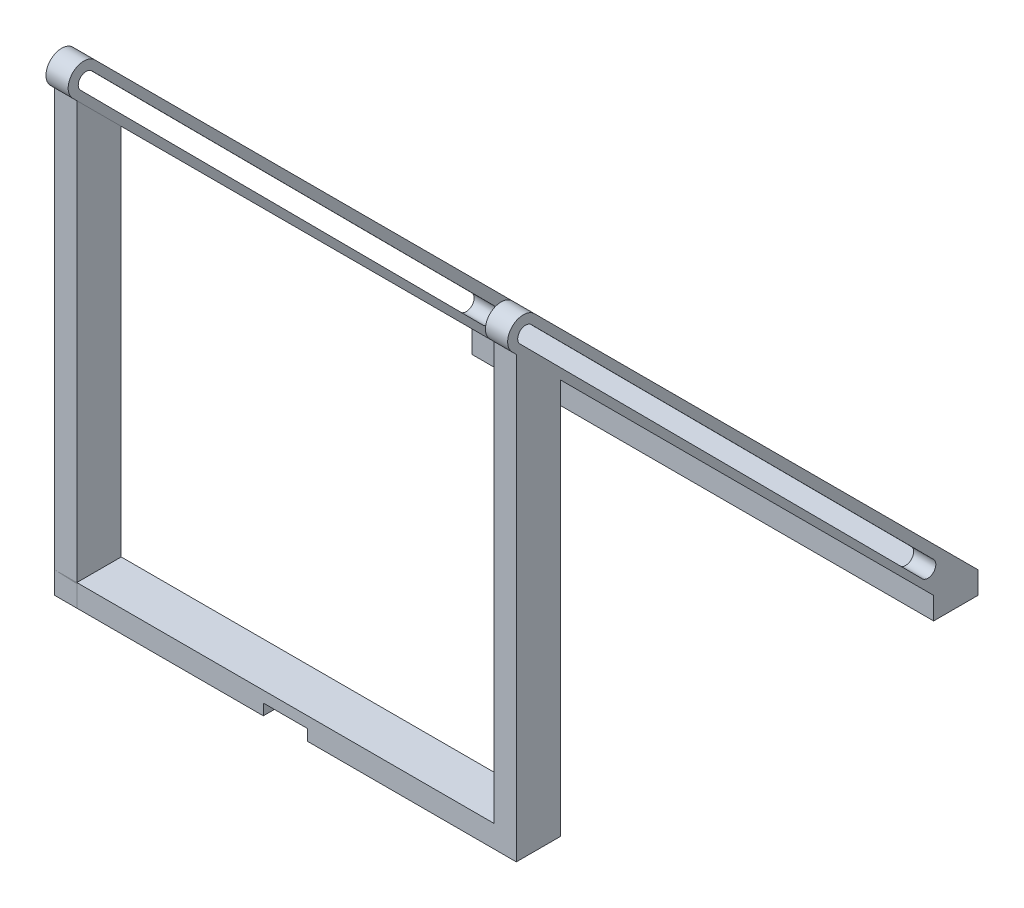
ISO-10303-21;
HEADER;
FILE_DESCRIPTION(('STEP AP214'),'2;1');
FILE_NAME('part.step','',(''),(''),'','','');
FILE_SCHEMA(('AUTOMOTIVE_DESIGN { 1 0 10303 214 1 1 1 1 }'));
ENDSEC;
DATA;
#1=APPLICATION_CONTEXT('core data for automotive mechanical design processes');
#2=APPLICATION_PROTOCOL_DEFINITION('international standard','automotive_design',2000,#1);
#3=PRODUCT_CONTEXT('',#1,'mechanical');
#4=PRODUCT('Part','Part','',(#3));
#5=PRODUCT_RELATED_PRODUCT_CATEGORY('part','',(#4));
#6=PRODUCT_DEFINITION_FORMATION('','',#4);
#7=PRODUCT_DEFINITION_CONTEXT('part definition',#1,'design');
#8=PRODUCT_DEFINITION('design','',#6,#7);
#9=PRODUCT_DEFINITION_SHAPE('','',#8);
#10=(LENGTH_UNIT() NAMED_UNIT(*) SI_UNIT(.MILLI.,.METRE.));
#11=(NAMED_UNIT(*) PLANE_ANGLE_UNIT() SI_UNIT($,.RADIAN.));
#12=(NAMED_UNIT(*) SI_UNIT($,.STERADIAN.) SOLID_ANGLE_UNIT());
#13=UNCERTAINTY_MEASURE_WITH_UNIT(LENGTH_MEASURE(1.E-05),#10,'distance_accuracy_value','');
#14=(GEOMETRIC_REPRESENTATION_CONTEXT(3) GLOBAL_UNCERTAINTY_ASSIGNED_CONTEXT((#13)) GLOBAL_UNIT_ASSIGNED_CONTEXT((#10,
#11,#12)) REPRESENTATION_CONTEXT('',''));
#15=CARTESIAN_POINT('',(0.,0.,0.));
#16=DIRECTION('',(0.,0.,1.));
#17=DIRECTION('',(1.,0.,0.));
#18=AXIS2_PLACEMENT_3D('',#15,#16,#17);
#19=CARTESIAN_POINT('',(-462.534,0.,462.534));
#20=DIRECTION('',(-1.,0.,0.));
#21=DIRECTION('',(0.,0.,1.));
#22=AXIS2_PLACEMENT_3D('',#19,#20,#21);
#23=PLANE('',#22);
#24=DIRECTION('',(0.,1.,0.));
#25=VECTOR('',#24,1.);
#26=CARTESIAN_POINT('',(-462.534,0.,462.534));
#27=LINE('',#26,#25);
#28=CARTESIAN_POINT('',(-462.534,0.,462.534));
#29=VERTEX_POINT('',#28);
#30=CARTESIAN_POINT('',(-462.534,880.618000000003,462.534));
#31=VERTEX_POINT('',#30);
#32=EDGE_CURVE('E48',#29,#31,#27,.T.);
#33=ORIENTED_EDGE('',*,*,#32,.T.);
#34=DIRECTION('',(0.,-0.707106781186549,-0.707106781186546));
#35=VECTOR('',#34,1.);
#36=CARTESIAN_POINT('',(-462.534,918.382115898591,500.298115898588));
#37=LINE('',#36,#35);
#38=CARTESIAN_POINT('',(-462.534,791.718000000003,373.634));
#39=VERTEX_POINT('',#38);
#40=EDGE_CURVE('E106',#31,#39,#37,.T.);
#41=ORIENTED_EDGE('',*,*,#40,.T.);
#42=DIRECTION('',(0.,1.,0.));
#43=VECTOR('',#42,1.);
#44=CARTESIAN_POINT('',(-462.534,0.,373.634));
#45=LINE('',#44,#43);
#46=CARTESIAN_POINT('',(-462.534,0.,373.634));
#47=VERTEX_POINT('',#46);
#48=EDGE_CURVE('E12',#47,#39,#45,.T.);
#49=ORIENTED_EDGE('',*,*,#48,.F.);
#50=DIRECTION('',(0.,0.,1.));
#51=VECTOR('',#50,1.);
#52=CARTESIAN_POINT('',(-462.534,0.,462.534));
#53=LINE('',#52,#51);
#54=EDGE_CURVE('E108',#47,#29,#53,.T.);
#55=ORIENTED_EDGE('',*,*,#54,.T.);
#56=EDGE_LOOP('',(#33,#41,#49,#55));
#57=FACE_BOUND('',#56,.T.);
#58=ADVANCED_FACE('F45',(#57),#23,.T.);
#59=CARTESIAN_POINT('',(-462.534,0.,373.634));
#60=DIRECTION('',(0.,0.,-1.));
#61=DIRECTION('',(-1.,0.,0.));
#62=AXIS2_PLACEMENT_3D('',#59,#60,#61);
#63=PLANE('',#62);
#64=ORIENTED_EDGE('',*,*,#48,.T.);
#65=DIRECTION('',(1.,0.,0.));
#66=VECTOR('',#65,1.);
#67=CARTESIAN_POINT('',(-462.534,791.718000000003,373.634));
#68=LINE('',#67,#66);
#69=CARTESIAN_POINT('',(-418.084,791.718000000003,373.634));
#70=VERTEX_POINT('',#69);
#71=EDGE_CURVE('E98',#39,#70,#68,.T.);
#72=ORIENTED_EDGE('',*,*,#71,.T.);
#73=DIRECTION('',(0.,1.,0.));
#74=VECTOR('',#73,1.);
#75=CARTESIAN_POINT('',(-418.084,0.,373.634));
#76=LINE('',#75,#74);
#77=CARTESIAN_POINT('',(-418.084,0.,373.634));
#78=VERTEX_POINT('',#77);
#79=EDGE_CURVE('E53',#78,#70,#76,.T.);
#80=ORIENTED_EDGE('',*,*,#79,.F.);
#81=DIRECTION('',(-1.,0.,0.));
#82=VECTOR('',#81,1.);
#83=CARTESIAN_POINT('',(-462.534,0.,373.634));
#84=LINE('',#83,#82);
#85=EDGE_CURVE('E114',#78,#47,#84,.T.);
#86=ORIENTED_EDGE('',*,*,#85,.T.);
#87=EDGE_LOOP('',(#64,#72,#80,#86));
#88=FACE_BOUND('',#87,.T.);
#89=ADVANCED_FACE('F102',(#88),#63,.T.);
#90=CARTESIAN_POINT('',(-418.084,0.,462.534));
#91=DIRECTION('',(1.,0.,0.));
#92=DIRECTION('',(0.,0.,-1.));
#93=AXIS2_PLACEMENT_3D('',#90,#91,#92);
#94=PLANE('',#93);
#95=ORIENTED_EDGE('',*,*,#79,.T.);
#96=DIRECTION('',(0.,0.707106781186549,0.707106781186546));
#97=VECTOR('',#96,1.);
#98=CARTESIAN_POINT('',(-418.084,918.382115898591,500.298115898588));
#99=LINE('',#98,#97);
#100=CARTESIAN_POINT('',(-418.084,880.618000000003,462.534));
#101=VERTEX_POINT('',#100);
#102=EDGE_CURVE('E87',#70,#101,#99,.T.);
#103=ORIENTED_EDGE('',*,*,#102,.T.);
#104=DIRECTION('',(0.,1.,0.));
#105=VECTOR('',#104,1.);
#106=CARTESIAN_POINT('',(-418.084,0.,462.534));
#107=LINE('',#106,#105);
#108=CARTESIAN_POINT('',(-418.084,0.,462.534));
#109=VERTEX_POINT('',#108);
#110=EDGE_CURVE('E91',#109,#101,#107,.T.);
#111=ORIENTED_EDGE('',*,*,#110,.F.);
#112=DIRECTION('',(0.,0.,-1.));
#113=VECTOR('',#112,1.);
#114=CARTESIAN_POINT('',(-418.084,0.,462.534));
#115=LINE('',#114,#113);
#116=EDGE_CURVE('E89',#109,#78,#115,.T.);
#117=ORIENTED_EDGE('',*,*,#116,.T.);
#118=EDGE_LOOP('',(#95,#103,#111,#117));
#119=FACE_BOUND('',#118,.T.);
#120=ADVANCED_FACE('F86',(#119),#94,.T.);
#121=CARTESIAN_POINT('',(-462.534,0.,462.534));
#122=DIRECTION('',(0.,0.,1.));
#123=DIRECTION('',(1.,0.,0.));
#124=AXIS2_PLACEMENT_3D('',#121,#122,#123);
#125=PLANE('',#124);
#126=ORIENTED_EDGE('',*,*,#110,.T.);
#127=DIRECTION('',(-1.,0.,0.));
#128=VECTOR('',#127,1.);
#129=CARTESIAN_POINT('',(-462.534,880.618000000003,462.534));
#130=LINE('',#129,#128);
#131=EDGE_CURVE('E100',#101,#31,#130,.T.);
#132=ORIENTED_EDGE('',*,*,#131,.T.);
#133=ORIENTED_EDGE('',*,*,#32,.F.);
#134=DIRECTION('',(1.,0.,0.));
#135=VECTOR('',#134,1.);
#136=CARTESIAN_POINT('',(-462.534,0.,462.534));
#137=LINE('',#136,#135);
#138=EDGE_CURVE('E110',#29,#109,#137,.T.);
#139=ORIENTED_EDGE('',*,*,#138,.T.);
#140=EDGE_LOOP('',(#126,#132,#133,#139));
#141=FACE_BOUND('',#140,.T.);
#142=ADVANCED_FACE('F117',(#141),#125,.T.);
#143=CARTESIAN_POINT('',(0.,0.,0.));
#144=DIRECTION('',(0.,-1.,0.));
#145=DIRECTION('',(0.,0.,-1.));
#146=AXIS2_PLACEMENT_3D('',#143,#144,#145);
#147=PLANE('',#146);
#148=ORIENTED_EDGE('',*,*,#54,.F.);
#149=ORIENTED_EDGE('',*,*,#85,.F.);
#150=ORIENTED_EDGE('',*,*,#116,.F.);
#151=ORIENTED_EDGE('',*,*,#138,.F.);
#152=EDGE_LOOP('',(#148,#149,#150,#151));
#153=FACE_BOUND('',#152,.T.);
#154=ADVANCED_FACE('F119',(#153),#147,.T.);
#155=CARTESIAN_POINT('',(-462.534,44.45,-373.634));
#156=DIRECTION('',(0.,-0.707106781186546,0.707106781186549));
#157=DIRECTION('',(0.,-0.707106781186549,-0.707106781186546));
#158=AXIS2_PLACEMENT_3D('',#155,#156,#157);
#159=PLANE('',#158);
#160=ORIENTED_EDGE('',*,*,#131,.F.);
#161=ORIENTED_EDGE('',*,*,#102,.F.);
#162=ORIENTED_EDGE('',*,*,#71,.F.);
#163=ORIENTED_EDGE('',*,*,#40,.F.);
#164=EDGE_LOOP('',(#160,#161,#162,#163));
#165=FACE_BOUND('',#164,.T.);
#166=ADVANCED_FACE('F96',(#165),#159,.F.);
#167=CLOSED_SHELL('',(#58,#89,#120,#142,#154,#166));
#168=MANIFOLD_SOLID_BREP('B2',#167);
#169=CARTESIAN_POINT('',(-418.084,911.044715683175,448.510715683172));
#170=DIRECTION('',(1.,0.,0.));
#171=DIRECTION('',(0.,0.,-1.));
#172=AXIS2_PLACEMENT_3D('',#169,#170,#171);
#173=CYLINDRICAL_SURFACE('',#172,31.4308964237421);
#174=DIRECTION('',(1.,0.,0.));
#175=VECTOR('',#174,1.);
#176=CARTESIAN_POINT('',(-462.534,888.819715683175,470.735715683172));
#177=LINE('',#176,#175);
#178=CARTESIAN_POINT('',(-418.084,888.819715683175,470.735715683172));
#179=VERTEX_POINT('',#178);
#180=CARTESIAN_POINT('',(-462.534,888.819715683175,470.735715683172));
#181=VERTEX_POINT('',#180);
#182=EDGE_CURVE('E299',#179,#181,#177,.F.);
#183=ORIENTED_EDGE('',*,*,#182,.F.);
#184=CARTESIAN_POINT('',(-418.084,911.044715683175,448.510715683172));
#185=DIRECTION('',(1.,0.,0.));
#186=DIRECTION('',(0.,0.,-1.));
#187=AXIS2_PLACEMENT_3D('',#184,#185,#186);
#188=CIRCLE('',#187,31.4308964237421);
#189=CARTESIAN_POINT('',(-418.084,933.269715683175,426.285715683172));
#190=VERTEX_POINT('',#189);
#191=EDGE_CURVE('E185',#190,#179,#188,.T.);
#192=ORIENTED_EDGE('',*,*,#191,.F.);
#193=DIRECTION('',(1.,0.,0.));
#194=VECTOR('',#193,1.);
#195=CARTESIAN_POINT('',(-462.534,933.269715683175,426.285715683172));
#196=LINE('',#195,#194);
#197=CARTESIAN_POINT('',(-462.534,933.269715683175,426.285715683172));
#198=VERTEX_POINT('',#197);
#199=EDGE_CURVE('E304',#198,#190,#196,.T.);
#200=ORIENTED_EDGE('',*,*,#199,.F.);
#201=CARTESIAN_POINT('',(-462.534,911.044715683175,448.510715683172));
#202=DIRECTION('',(-1.,0.,0.));
#203=DIRECTION('',(0.,0.,1.));
#204=AXIS2_PLACEMENT_3D('',#201,#202,#203);
#205=CIRCLE('',#204,31.4308964237421);
#206=EDGE_CURVE('E43',#181,#198,#205,.T.);
#207=ORIENTED_EDGE('',*,*,#206,.F.);
#208=EDGE_LOOP('',(#183,#192,#200,#207));
#209=FACE_BOUND('',#208,.T.);
#210=ADVANCED_FACE('F177',(#209),#173,.T.);
#211=CARTESIAN_POINT('',(0.,44.45,0.));
#212=DIRECTION('',(0.,1.,0.));
#213=DIRECTION('',(0.,0.,1.));
#214=AXIS2_PLACEMENT_3D('',#211,#212,#213);
#215=PLANE('',#214);
#216=DIRECTION('',(0.,0.,1.));
#217=VECTOR('',#216,1.);
#218=CARTESIAN_POINT('',(-462.534,44.45,-462.534));
#219=LINE('',#218,#217);
#220=CARTESIAN_POINT('',(-462.534,44.45,-462.534));
#221=VERTEX_POINT('',#220);
#222=CARTESIAN_POINT('',(-462.534,44.45,-373.634));
#223=VERTEX_POINT('',#222);
#224=EDGE_CURVE('E274',#221,#223,#219,.T.);
#225=ORIENTED_EDGE('',*,*,#224,.F.);
#226=DIRECTION('',(-1.,0.,0.));
#227=VECTOR('',#226,1.);
#228=CARTESIAN_POINT('',(-462.534,44.45,-462.534));
#229=LINE('',#228,#227);
#230=CARTESIAN_POINT('',(-418.084,44.45,-462.534));
#231=VERTEX_POINT('',#230);
#232=EDGE_CURVE('E288',#231,#221,#229,.T.);
#233=ORIENTED_EDGE('',*,*,#232,.F.);
#234=DIRECTION('',(0.,0.,-1.));
#235=VECTOR('',#234,1.);
#236=CARTESIAN_POINT('',(-418.084,44.45,-462.534));
#237=LINE('',#236,#235);
#238=CARTESIAN_POINT('',(-418.084,44.45,-373.634));
#239=VERTEX_POINT('',#238);
#240=EDGE_CURVE('E291',#239,#231,#237,.T.);
#241=ORIENTED_EDGE('',*,*,#240,.F.);
#242=DIRECTION('',(1.,0.,0.));
#243=VECTOR('',#242,1.);
#244=CARTESIAN_POINT('',(-462.534,44.45,-373.634));
#245=LINE('',#244,#243);
#246=EDGE_CURVE('E280',#223,#239,#245,.T.);
#247=ORIENTED_EDGE('',*,*,#246,.F.);
#248=EDGE_LOOP('',(#225,#233,#241,#247));
#249=FACE_BOUND('',#248,.T.);
#250=ADVANCED_FACE('F315',(#249),#215,.F.);
#251=CARTESIAN_POINT('',(-462.534,44.45,-462.534));
#252=DIRECTION('',(-1.,0.,0.));
#253=DIRECTION('',(0.,0.,1.));
#254=AXIS2_PLACEMENT_3D('',#251,#252,#253);
#255=PLANE('',#254);
#256=CARTESIAN_POINT('',(-462.534,95.810254037124,-362.12613366491));
#257=DIRECTION('',(-1.,0.,0.));
#258=DIRECTION('',(0.,0.,1.));
#259=AXIS2_PLACEMENT_3D('',#256,#257,#258);
#260=CIRCLE('',#259,15.875);
#261=CARTESIAN_POINT('',(-462.534,107.004633732663,-373.382309224668));
#262=VERTEX_POINT('',#261);
#263=CARTESIAN_POINT('',(-462.534,84.6158743415852,-350.869958105151));
#264=VERTEX_POINT('',#263);
#265=EDGE_CURVE('E192',#262,#264,#260,.T.);
#266=ORIENTED_EDGE('',*,*,#265,.F.);
#267=DIRECTION('',(0.,-0.709050428961181,-0.705157776096928));
#268=VECTOR('',#267,1.);
#269=CARTESIAN_POINT('',(-462.534,107.004633732663,-373.382309224668));
#270=LINE('',#269,#268);
#271=CARTESIAN_POINT('',(-462.534,917.449274035293,432.61302885412));
#272=VERTEX_POINT('',#271);
#273=EDGE_CURVE('E259',#272,#262,#270,.T.);
#274=ORIENTED_EDGE('',*,*,#273,.F.);
#275=CARTESIAN_POINT('',(-462.534,906.254894339754,443.869204413879));
#276=DIRECTION('',(-1.,0.,0.));
#277=DIRECTION('',(0.,0.,1.));
#278=AXIS2_PLACEMENT_3D('',#275,#276,#277);
#279=CIRCLE('',#278,15.8749999999995);
#280=CARTESIAN_POINT('',(-462.534,895.060514644216,455.125379973637));
#281=VERTEX_POINT('',#280);
#282=EDGE_CURVE('E262',#281,#272,#279,.T.);
#283=ORIENTED_EDGE('',*,*,#282,.F.);
#284=DIRECTION('',(0.,0.709050428961182,0.705157776096928));
#285=VECTOR('',#284,1.);
#286=CARTESIAN_POINT('',(-462.534,84.6158743415853,-350.869958105151));
#287=LINE('',#286,#285);
#288=EDGE_CURVE('E268',#264,#281,#287,.T.);
#289=ORIENTED_EDGE('',*,*,#288,.F.);
#290=EDGE_LOOP('',(#266,#274,#283,#289));
#291=FACE_BOUND('',#290,.T.);
#292=DIRECTION('',(0.,0.707106781186549,0.707106781186546));
#293=VECTOR('',#292,1.);
#294=CARTESIAN_POINT('',(-462.534,44.45,-373.634));
#295=LINE('',#294,#293);
#296=EDGE_CURVE('E281',#223,#181,#295,.T.);
#297=ORIENTED_EDGE('',*,*,#296,.T.);
#298=ORIENTED_EDGE('',*,*,#206,.T.);
#299=DIRECTION('',(0.,0.707106781186549,0.707106781186546));
#300=VECTOR('',#299,1.);
#301=CARTESIAN_POINT('',(-462.534,44.45,-462.534));
#302=LINE('',#301,#300);
#303=EDGE_CURVE('E285',#221,#198,#302,.T.);
#304=ORIENTED_EDGE('',*,*,#303,.F.);
#305=ORIENTED_EDGE('',*,*,#224,.T.);
#306=EDGE_LOOP('',(#297,#298,#304,#305));
#307=FACE_BOUND('',#306,.T.);
#308=ADVANCED_FACE('F318',(#291,#307),#255,.T.);
#309=CARTESIAN_POINT('',(-462.534,44.45,-373.634));
#310=DIRECTION('',(0.,-0.707106781186546,0.707106781186549));
#311=DIRECTION('',(0.,-0.707106781186549,-0.707106781186546));
#312=AXIS2_PLACEMENT_3D('',#309,#310,#311);
#313=PLANE('',#312);
#314=DIRECTION('',(0.,0.707106781186549,0.707106781186546));
#315=VECTOR('',#314,1.);
#316=CARTESIAN_POINT('',(-418.084,44.45,-373.634));
#317=LINE('',#316,#315);
#318=EDGE_CURVE('E284',#239,#179,#317,.T.);
#319=ORIENTED_EDGE('',*,*,#318,.T.);
#320=ORIENTED_EDGE('',*,*,#182,.T.);
#321=ORIENTED_EDGE('',*,*,#296,.F.);
#322=ORIENTED_EDGE('',*,*,#246,.T.);
#323=EDGE_LOOP('',(#319,#320,#321,#322));
#324=FACE_BOUND('',#323,.T.);
#325=ADVANCED_FACE('F313',(#324),#313,.T.);
#326=CARTESIAN_POINT('',(-418.084,44.45,-462.534));
#327=DIRECTION('',(1.,0.,0.));
#328=DIRECTION('',(0.,0.,-1.));
#329=AXIS2_PLACEMENT_3D('',#326,#327,#328);
#330=PLANE('',#329);
#331=CARTESIAN_POINT('',(-418.084,95.810254037124,-362.12613366491));
#332=DIRECTION('',(-1.,0.,0.));
#333=DIRECTION('',(0.,0.,1.));
#334=AXIS2_PLACEMENT_3D('',#331,#332,#333);
#335=CIRCLE('',#334,15.875);
#336=CARTESIAN_POINT('',(-418.084,107.004633732663,-373.382309224668));
#337=VERTEX_POINT('',#336);
#338=CARTESIAN_POINT('',(-418.084,84.6158743415853,-350.869958105151));
#339=VERTEX_POINT('',#338);
#340=EDGE_CURVE('E243',#337,#339,#335,.T.);
#341=ORIENTED_EDGE('',*,*,#340,.T.);
#342=DIRECTION('',(0.,0.709050428961182,0.705157776096928));
#343=VECTOR('',#342,1.);
#344=CARTESIAN_POINT('',(-418.084,84.6158743415853,-350.869958105151));
#345=LINE('',#344,#343);
#346=CARTESIAN_POINT('',(-418.084,895.060514644216,455.125379973637));
#347=VERTEX_POINT('',#346);
#348=EDGE_CURVE('E252',#339,#347,#345,.T.);
#349=ORIENTED_EDGE('',*,*,#348,.T.);
#350=CARTESIAN_POINT('',(-418.084,906.254894339754,443.869204413879));
#351=DIRECTION('',(-1.,0.,0.));
#352=DIRECTION('',(0.,0.,1.));
#353=AXIS2_PLACEMENT_3D('',#350,#351,#352);
#354=CIRCLE('',#353,15.8749999999995);
#355=CARTESIAN_POINT('',(-418.084,917.449274035293,432.61302885412));
#356=VERTEX_POINT('',#355);
#357=EDGE_CURVE('E200',#347,#356,#354,.T.);
#358=ORIENTED_EDGE('',*,*,#357,.T.);
#359=DIRECTION('',(0.,-0.709050428961181,-0.705157776096928));
#360=VECTOR('',#359,1.);
#361=CARTESIAN_POINT('',(-418.084,107.004633732663,-373.382309224668));
#362=LINE('',#361,#360);
#363=EDGE_CURVE('E249',#356,#337,#362,.T.);
#364=ORIENTED_EDGE('',*,*,#363,.T.);
#365=EDGE_LOOP('',(#341,#349,#358,#364));
#366=FACE_BOUND('',#365,.T.);
#367=DIRECTION('',(0.,0.707106781186549,0.707106781186546));
#368=VECTOR('',#367,1.);
#369=CARTESIAN_POINT('',(-418.084,44.45,-462.534));
#370=LINE('',#369,#368);
#371=EDGE_CURVE('E294',#231,#190,#370,.T.);
#372=ORIENTED_EDGE('',*,*,#371,.T.);
#373=ORIENTED_EDGE('',*,*,#191,.T.);
#374=ORIENTED_EDGE('',*,*,#318,.F.);
#375=ORIENTED_EDGE('',*,*,#240,.T.);
#376=EDGE_LOOP('',(#372,#373,#374,#375));
#377=FACE_BOUND('',#376,.T.);
#378=ADVANCED_FACE('F256',(#366,#377),#330,.T.);
#379=CARTESIAN_POINT('',(-462.534,44.45,-462.534));
#380=DIRECTION('',(0.,0.707106781186546,-0.707106781186549));
#381=DIRECTION('',(0.,0.707106781186549,0.707106781186546));
#382=AXIS2_PLACEMENT_3D('',#379,#380,#381);
#383=PLANE('',#382);
#384=ORIENTED_EDGE('',*,*,#303,.T.);
#385=ORIENTED_EDGE('',*,*,#199,.T.);
#386=ORIENTED_EDGE('',*,*,#371,.F.);
#387=ORIENTED_EDGE('',*,*,#232,.T.);
#388=EDGE_LOOP('',(#384,#385,#386,#387));
#389=FACE_BOUND('',#388,.T.);
#390=ADVANCED_FACE('F320',(#389),#383,.T.);
#391=CARTESIAN_POINT('',(-418.084,95.810254037124,-362.12613366491));
#392=DIRECTION('',(-1.,0.,0.));
#393=DIRECTION('',(0.,0.,1.));
#394=AXIS2_PLACEMENT_3D('',#391,#392,#393);
#395=CYLINDRICAL_SURFACE('',#394,15.875);
#396=ORIENTED_EDGE('',*,*,#265,.T.);
#397=DIRECTION('',(-1.,0.,0.));
#398=VECTOR('',#397,1.);
#399=CARTESIAN_POINT('',(-418.084,84.6158743415853,-350.869958105151));
#400=LINE('',#399,#398);
#401=EDGE_CURVE('E239',#339,#264,#400,.T.);
#402=ORIENTED_EDGE('',*,*,#401,.F.);
#403=ORIENTED_EDGE('',*,*,#340,.F.);
#404=DIRECTION('',(-1.,0.,0.));
#405=VECTOR('',#404,1.);
#406=CARTESIAN_POINT('',(-418.084,107.004633732663,-373.382309224668));
#407=LINE('',#406,#405);
#408=EDGE_CURVE('E272',#337,#262,#407,.T.);
#409=ORIENTED_EDGE('',*,*,#408,.T.);
#410=EDGE_LOOP('',(#396,#402,#403,#409));
#411=FACE_BOUND('',#410,.T.);
#412=ADVANCED_FACE('F241',(#411),#395,.F.);
#413=CARTESIAN_POINT('',(-418.084,107.004633732663,-373.382309224668));
#414=DIRECTION('',(0.,0.705157776096928,-0.709050428961181));
#415=DIRECTION('',(0.,0.709050428961181,0.705157776096928));
#416=AXIS2_PLACEMENT_3D('',#413,#414,#415);
#417=PLANE('',#416);
#418=ORIENTED_EDGE('',*,*,#273,.T.);
#419=ORIENTED_EDGE('',*,*,#408,.F.);
#420=ORIENTED_EDGE('',*,*,#363,.F.);
#421=DIRECTION('',(-1.,0.,0.));
#422=VECTOR('',#421,1.);
#423=CARTESIAN_POINT('',(-418.084,917.449274035293,432.61302885412));
#424=LINE('',#423,#422);
#425=EDGE_CURVE('E275',#356,#272,#424,.T.);
#426=ORIENTED_EDGE('',*,*,#425,.T.);
#427=EDGE_LOOP('',(#418,#419,#420,#426));
#428=FACE_BOUND('',#427,.T.);
#429=ADVANCED_FACE('F327',(#428),#417,.F.);
#430=CARTESIAN_POINT('',(-418.084,906.254894339754,443.869204413879));
#431=DIRECTION('',(-1.,0.,0.));
#432=DIRECTION('',(0.,0.,1.));
#433=AXIS2_PLACEMENT_3D('',#430,#431,#432);
#434=CYLINDRICAL_SURFACE('',#433,15.8749999999995);
#435=ORIENTED_EDGE('',*,*,#282,.T.);
#436=ORIENTED_EDGE('',*,*,#425,.F.);
#437=ORIENTED_EDGE('',*,*,#357,.F.);
#438=DIRECTION('',(-1.,0.,0.));
#439=VECTOR('',#438,1.);
#440=CARTESIAN_POINT('',(-418.084,895.060514644216,455.125379973637));
#441=LINE('',#440,#439);
#442=EDGE_CURVE('E248',#347,#281,#441,.T.);
#443=ORIENTED_EDGE('',*,*,#442,.T.);
#444=EDGE_LOOP('',(#435,#436,#437,#443));
#445=FACE_BOUND('',#444,.T.);
#446=ADVANCED_FACE('F346',(#445),#434,.F.);
#447=CARTESIAN_POINT('',(-418.084,84.6158743415853,-350.869958105151));
#448=DIRECTION('',(0.,-0.705157776096927,0.709050428961182));
#449=DIRECTION('',(0.,-0.709050428961182,-0.705157776096927));
#450=AXIS2_PLACEMENT_3D('',#447,#448,#449);
#451=PLANE('',#450);
#452=ORIENTED_EDGE('',*,*,#288,.T.);
#453=ORIENTED_EDGE('',*,*,#442,.F.);
#454=ORIENTED_EDGE('',*,*,#348,.F.);
#455=ORIENTED_EDGE('',*,*,#401,.T.);
#456=EDGE_LOOP('',(#452,#453,#454,#455));
#457=FACE_BOUND('',#456,.T.);
#458=ADVANCED_FACE('F253',(#457),#451,.F.);
#459=CLOSED_SHELL('',(#210,#250,#308,#325,#378,#390,#412,#429,#446,#458));
#460=MANIFOLD_SOLID_BREP('B6',#459);
#461=CARTESIAN_POINT('',(-462.534,44.45,462.534));
#462=DIRECTION('',(0.,0.,-1.));
#463=DIRECTION('',(-1.,0.,0.));
#464=AXIS2_PLACEMENT_3D('',#461,#462,#463);
#465=PLANE('',#464);
#466=DIRECTION('',(0.,1.,0.));
#467=VECTOR('',#466,1.);
#468=CARTESIAN_POINT('',(44.4499999999999,44.45,462.534));
#469=LINE('',#468,#467);
#470=CARTESIAN_POINT('',(44.45,0.,462.534));
#471=VERTEX_POINT('',#470);
#472=CARTESIAN_POINT('',(44.45,22.225,462.534));
#473=VERTEX_POINT('',#472);
#474=EDGE_CURVE('E737',#471,#473,#469,.T.);
#475=ORIENTED_EDGE('',*,*,#474,.F.);
#476=DIRECTION('',(1.,0.,0.));
#477=VECTOR('',#476,1.);
#478=CARTESIAN_POINT('',(-462.534,0.,462.534));
#479=LINE('',#478,#477);
#480=CARTESIAN_POINT('',(462.534,0.,462.534));
#481=VERTEX_POINT('',#480);
#482=EDGE_CURVE('E690',#471,#481,#479,.T.);
#483=ORIENTED_EDGE('',*,*,#482,.T.);
#484=DIRECTION('',(0.,-1.,0.));
#485=VECTOR('',#484,1.);
#486=CARTESIAN_POINT('',(462.534,44.45,462.534));
#487=LINE('',#486,#485);
#488=CARTESIAN_POINT('',(462.534,880.618000000003,462.534));
#489=VERTEX_POINT('',#488);
#490=EDGE_CURVE('E588',#489,#481,#487,.T.);
#491=ORIENTED_EDGE('',*,*,#490,.F.);
#492=DIRECTION('',(1.,0.,0.));
#493=VECTOR('',#492,1.);
#494=CARTESIAN_POINT('',(462.534,880.618000000003,462.534));
#495=LINE('',#494,#493);
#496=CARTESIAN_POINT('',(418.084,880.618000000003,462.534));
#497=VERTEX_POINT('',#496);
#498=EDGE_CURVE('E705',#497,#489,#495,.T.);
#499=ORIENTED_EDGE('',*,*,#498,.F.);
#500=DIRECTION('',(0.,1.,0.));
#501=VECTOR('',#500,1.);
#502=CARTESIAN_POINT('',(418.084,0.,462.534));
#503=LINE('',#502,#501);
#504=CARTESIAN_POINT('',(418.084,44.45,462.534));
#505=VERTEX_POINT('',#504);
#506=EDGE_CURVE('E432',#505,#497,#503,.T.);
#507=ORIENTED_EDGE('',*,*,#506,.F.);
#508=DIRECTION('',(1.,0.,0.));
#509=VECTOR('',#508,1.);
#510=CARTESIAN_POINT('',(-462.534,44.45,462.534));
#511=LINE('',#510,#509);
#512=CARTESIAN_POINT('',(-462.534,44.45,462.534));
#513=VERTEX_POINT('',#512);
#514=EDGE_CURVE('E719',#513,#505,#511,.T.);
#515=ORIENTED_EDGE('',*,*,#514,.F.);
#516=DIRECTION('',(0.,-1.,0.));
#517=VECTOR('',#516,1.);
#518=CARTESIAN_POINT('',(-462.534,44.45,462.534));
#519=LINE('',#518,#517);
#520=CARTESIAN_POINT('',(-462.534,0.,462.534));
#521=VERTEX_POINT('',#520);
#522=EDGE_CURVE('E591',#513,#521,#519,.T.);
#523=ORIENTED_EDGE('',*,*,#522,.T.);
#524=CARTESIAN_POINT('',(-44.45,0.,462.534));
#525=VERTEX_POINT('',#524);
#526=EDGE_CURVE('E578',#521,#525,#479,.T.);
#527=ORIENTED_EDGE('',*,*,#526,.T.);
#528=DIRECTION('',(0.,1.,0.));
#529=VECTOR('',#528,1.);
#530=CARTESIAN_POINT('',(-44.45,44.45,462.534));
#531=LINE('',#530,#529);
#532=CARTESIAN_POINT('',(-44.45,22.225,462.534));
#533=VERTEX_POINT('',#532);
#534=EDGE_CURVE('E424',#525,#533,#531,.T.);
#535=ORIENTED_EDGE('',*,*,#534,.T.);
#536=DIRECTION('',(1.,0.,0.));
#537=VECTOR('',#536,1.);
#538=CARTESIAN_POINT('',(-462.534,22.225,462.534));
#539=LINE('',#538,#537);
#540=EDGE_CURVE('E733',#533,#473,#539,.T.);
#541=ORIENTED_EDGE('',*,*,#540,.T.);
#542=EDGE_LOOP('',(#475,#483,#491,#499,#507,#515,#523,#527,#535,#541));
#543=FACE_BOUND('',#542,.T.);
#544=ADVANCED_FACE('F409',(#543),#465,.F.);
#545=CARTESIAN_POINT('',(-462.534,44.45,373.634));
#546=DIRECTION('',(0.,0.,1.));
#547=DIRECTION('',(1.,0.,0.));
#548=AXIS2_PLACEMENT_3D('',#545,#546,#547);
#549=PLANE('',#548);
#550=DIRECTION('',(0.,-1.,0.));
#551=VECTOR('',#550,1.);
#552=CARTESIAN_POINT('',(44.4499999999999,44.45,373.634));
#553=LINE('',#552,#551);
#554=CARTESIAN_POINT('',(44.45,22.225,373.634));
#555=VERTEX_POINT('',#554);
#556=CARTESIAN_POINT('',(44.45,0.,373.634));
#557=VERTEX_POINT('',#556);
#558=EDGE_CURVE('E693',#555,#557,#553,.T.);
#559=ORIENTED_EDGE('',*,*,#558,.F.);
#560=DIRECTION('',(-1.,0.,0.));
#561=VECTOR('',#560,1.);
#562=CARTESIAN_POINT('',(-462.534,22.225,373.634));
#563=LINE('',#562,#561);
#564=CARTESIAN_POINT('',(-44.45,22.225,373.634));
#565=VERTEX_POINT('',#564);
#566=EDGE_CURVE('E175',#555,#565,#563,.T.);
#567=ORIENTED_EDGE('',*,*,#566,.T.);
#568=DIRECTION('',(0.,-1.,0.));
#569=VECTOR('',#568,1.);
#570=CARTESIAN_POINT('',(-44.45,44.45,373.634));
#571=LINE('',#570,#569);
#572=CARTESIAN_POINT('',(-44.45,0.,373.634));
#573=VERTEX_POINT('',#572);
#574=EDGE_CURVE('E554',#565,#573,#571,.T.);
#575=ORIENTED_EDGE('',*,*,#574,.T.);
#576=DIRECTION('',(-1.,0.,0.));
#577=VECTOR('',#576,1.);
#578=CARTESIAN_POINT('',(-462.534,0.,373.634));
#579=LINE('',#578,#577);
#580=CARTESIAN_POINT('',(-462.534,0.,373.634));
#581=VERTEX_POINT('',#580);
#582=EDGE_CURVE('E565',#573,#581,#579,.T.);
#583=ORIENTED_EDGE('',*,*,#582,.T.);
#584=DIRECTION('',(0.,-1.,0.));
#585=VECTOR('',#584,1.);
#586=CARTESIAN_POINT('',(-462.534,44.45,373.634));
#587=LINE('',#586,#585);
#588=CARTESIAN_POINT('',(-462.534,44.45,373.634));
#589=VERTEX_POINT('',#588);
#590=EDGE_CURVE('E582',#589,#581,#587,.T.);
#591=ORIENTED_EDGE('',*,*,#590,.F.);
#592=DIRECTION('',(-1.,0.,0.));
#593=VECTOR('',#592,1.);
#594=CARTESIAN_POINT('',(-462.534,44.45,373.634));
#595=LINE('',#594,#593);
#596=CARTESIAN_POINT('',(418.084,44.45,373.634));
#597=VERTEX_POINT('',#596);
#598=EDGE_CURVE('E585',#597,#589,#595,.T.);
#599=ORIENTED_EDGE('',*,*,#598,.F.);
#600=DIRECTION('',(0.,1.,0.));
#601=VECTOR('',#600,1.);
#602=CARTESIAN_POINT('',(418.084,0.,373.634));
#603=LINE('',#602,#601);
#604=CARTESIAN_POINT('',(418.084,791.718000000003,373.634));
#605=VERTEX_POINT('',#604);
#606=EDGE_CURVE('E713',#597,#605,#603,.T.);
#607=ORIENTED_EDGE('',*,*,#606,.T.);
#608=DIRECTION('',(-1.,0.,0.));
#609=VECTOR('',#608,1.);
#610=CARTESIAN_POINT('',(462.534,791.718000000003,373.634));
#611=LINE('',#610,#609);
#612=CARTESIAN_POINT('',(462.534,791.718000000003,373.634));
#613=VERTEX_POINT('',#612);
#614=EDGE_CURVE('E696',#613,#605,#611,.T.);
#615=ORIENTED_EDGE('',*,*,#614,.F.);
#616=DIRECTION('',(0.,-1.,0.));
#617=VECTOR('',#616,1.);
#618=CARTESIAN_POINT('',(462.534,44.45,373.634));
#619=LINE('',#618,#617);
#620=CARTESIAN_POINT('',(462.534,0.,373.634));
#621=VERTEX_POINT('',#620);
#622=EDGE_CURVE('E584',#613,#621,#619,.T.);
#623=ORIENTED_EDGE('',*,*,#622,.T.);
#624=EDGE_CURVE('E573',#621,#557,#579,.T.);
#625=ORIENTED_EDGE('',*,*,#624,.T.);
#626=EDGE_LOOP('',(#559,#567,#575,#583,#591,#599,#607,#615,#623,#625));
#627=FACE_BOUND('',#626,.T.);
#628=ADVANCED_FACE('F563',(#627),#549,.F.);
#629=CARTESIAN_POINT('',(0.,0.,0.));
#630=DIRECTION('',(0.,-1.,0.));
#631=DIRECTION('',(0.,0.,-1.));
#632=AXIS2_PLACEMENT_3D('',#629,#630,#631);
#633=PLANE('',#632);
#634=ORIENTED_EDGE('',*,*,#482,.F.);
#635=DIRECTION('',(0.,0.,-1.));
#636=VECTOR('',#635,1.);
#637=CARTESIAN_POINT('',(44.45,0.,0.));
#638=LINE('',#637,#636);
#639=EDGE_CURVE('E417',#471,#557,#638,.T.);
#640=ORIENTED_EDGE('',*,*,#639,.T.);
#641=ORIENTED_EDGE('',*,*,#624,.F.);
#642=DIRECTION('',(0.,0.,-1.));
#643=VECTOR('',#642,1.);
#644=CARTESIAN_POINT('',(462.534,0.,462.534));
#645=LINE('',#644,#643);
#646=EDGE_CURVE('E574',#481,#621,#645,.T.);
#647=ORIENTED_EDGE('',*,*,#646,.F.);
#648=EDGE_LOOP('',(#634,#640,#641,#647));
#649=FACE_BOUND('',#648,.T.);
#650=ADVANCED_FACE('F688',(#649),#633,.T.);
#651=CARTESIAN_POINT('',(462.534,44.45,-373.634));
#652=DIRECTION('',(0.,-0.707106781186546,0.707106781186549));
#653=DIRECTION('',(0.,-0.707106781186549,-0.707106781186546));
#654=AXIS2_PLACEMENT_3D('',#651,#652,#653);
#655=PLANE('',#654);
#656=DIRECTION('',(0.,0.707106781186549,0.707106781186546));
#657=VECTOR('',#656,1.);
#658=CARTESIAN_POINT('',(418.084,44.45,-373.634));
#659=LINE('',#658,#657);
#660=CARTESIAN_POINT('',(418.084,888.819715683175,470.735715683172));
#661=VERTEX_POINT('',#660);
#662=EDGE_CURVE('E630',#497,#661,#659,.T.);
#663=ORIENTED_EDGE('',*,*,#662,.F.);
#664=ORIENTED_EDGE('',*,*,#498,.T.);
#665=DIRECTION('',(0.,0.707106781186549,0.707106781186546));
#666=VECTOR('',#665,1.);
#667=CARTESIAN_POINT('',(462.534,44.45,-373.634));
#668=LINE('',#667,#666);
#669=CARTESIAN_POINT('',(462.534,888.819715683175,470.735715683172));
#670=VERTEX_POINT('',#669);
#671=EDGE_CURVE('E624',#489,#670,#668,.T.);
#672=ORIENTED_EDGE('',*,*,#671,.T.);
#673=DIRECTION('',(-1.,0.,0.));
#674=VECTOR('',#673,1.);
#675=CARTESIAN_POINT('',(462.534,888.819715683175,470.735715683172));
#676=LINE('',#675,#674);
#677=EDGE_CURVE('E594',#661,#670,#676,.F.);
#678=ORIENTED_EDGE('',*,*,#677,.F.);
#679=EDGE_LOOP('',(#663,#664,#672,#678));
#680=FACE_BOUND('',#679,.T.);
#681=ADVANCED_FACE('F708',(#680),#655,.T.);
#682=CARTESIAN_POINT('',(462.534,44.45,-373.634));
#683=VERTEX_POINT('',#682);
#684=EDGE_CURVE('E625',#683,#613,#668,.T.);
#685=ORIENTED_EDGE('',*,*,#684,.T.);
#686=ORIENTED_EDGE('',*,*,#614,.T.);
#687=CARTESIAN_POINT('',(418.084,44.45,-373.634));
#688=VERTEX_POINT('',#687);
#689=EDGE_CURVE('E631',#688,#605,#659,.T.);
#690=ORIENTED_EDGE('',*,*,#689,.F.);
#691=DIRECTION('',(-1.,0.,0.));
#692=VECTOR('',#691,1.);
#693=CARTESIAN_POINT('',(462.534,44.45,-373.634));
#694=LINE('',#693,#692);
#695=EDGE_CURVE('E609',#683,#688,#694,.T.);
#696=ORIENTED_EDGE('',*,*,#695,.F.);
#697=EDGE_LOOP('',(#685,#686,#690,#696));
#698=FACE_BOUND('',#697,.T.);
#699=ADVANCED_FACE('F775',(#698),#655,.T.);
#700=CARTESIAN_POINT('',(0.,44.45,0.));
#701=DIRECTION('',(0.,1.,0.));
#702=DIRECTION('',(0.,0.,1.));
#703=AXIS2_PLACEMENT_3D('',#700,#701,#702);
#704=PLANE('',#703);
#705=DIRECTION('',(1.,0.,0.));
#706=VECTOR('',#705,1.);
#707=CARTESIAN_POINT('',(-462.534,44.45,-373.634));
#708=LINE('',#707,#706);
#709=CARTESIAN_POINT('',(-462.534,44.45,-373.634));
#710=VERTEX_POINT('',#709);
#711=EDGE_CURVE('E660',#710,#688,#708,.T.);
#712=ORIENTED_EDGE('',*,*,#711,.T.);
#713=DIRECTION('',(0.,0.,-1.));
#714=VECTOR('',#713,1.);
#715=CARTESIAN_POINT('',(418.084,44.45,-462.534));
#716=LINE('',#715,#714);
#717=CARTESIAN_POINT('',(418.084,44.45,-462.534));
#718=VERTEX_POINT('',#717);
#719=EDGE_CURVE('E606',#688,#718,#716,.T.);
#720=ORIENTED_EDGE('',*,*,#719,.T.);
#721=DIRECTION('',(-1.,0.,0.));
#722=VECTOR('',#721,1.);
#723=CARTESIAN_POINT('',(-462.534,44.45,-462.534));
#724=LINE('',#723,#722);
#725=CARTESIAN_POINT('',(-462.534,44.45,-462.534));
#726=VERTEX_POINT('',#725);
#727=EDGE_CURVE('E664',#718,#726,#724,.T.);
#728=ORIENTED_EDGE('',*,*,#727,.T.);
#729=DIRECTION('',(0.,0.,1.));
#730=VECTOR('',#729,1.);
#731=CARTESIAN_POINT('',(-462.534,44.45,-462.534));
#732=LINE('',#731,#730);
#733=EDGE_CURVE('E657',#726,#710,#732,.T.);
#734=ORIENTED_EDGE('',*,*,#733,.T.);
#735=EDGE_LOOP('',(#712,#720,#728,#734));
#736=FACE_BOUND('',#735,.T.);
#737=ADVANCED_FACE('F798',(#736),#704,.T.);
#738=CARTESIAN_POINT('',(-462.534,44.45,-462.534));
#739=DIRECTION('',(1.,0.,0.));
#740=DIRECTION('',(0.,0.,-1.));
#741=AXIS2_PLACEMENT_3D('',#738,#739,#740);
#742=PLANE('',#741);
#743=DIRECTION('',(0.,0.,1.));
#744=VECTOR('',#743,1.);
#745=CARTESIAN_POINT('',(-462.534,0.,-462.534));
#746=LINE('',#745,#744);
#747=CARTESIAN_POINT('',(-462.534,0.,-462.534));
#748=VERTEX_POINT('',#747);
#749=CARTESIAN_POINT('',(-462.534,0.,-373.634));
#750=VERTEX_POINT('',#749);
#751=EDGE_CURVE('E656',#748,#750,#746,.T.);
#752=ORIENTED_EDGE('',*,*,#751,.T.);
#753=DIRECTION('',(0.,-1.,0.));
#754=VECTOR('',#753,1.);
#755=CARTESIAN_POINT('',(-462.534,44.45,-373.634));
#756=LINE('',#755,#754);
#757=EDGE_CURVE('E559',#710,#750,#756,.T.);
#758=ORIENTED_EDGE('',*,*,#757,.F.);
#759=ORIENTED_EDGE('',*,*,#733,.F.);
#760=DIRECTION('',(0.,-1.,0.));
#761=VECTOR('',#760,1.);
#762=CARTESIAN_POINT('',(-462.534,44.45,-462.534));
#763=LINE('',#762,#761);
#764=EDGE_CURVE('E667',#726,#748,#763,.T.);
#765=ORIENTED_EDGE('',*,*,#764,.T.);
#766=EDGE_LOOP('',(#752,#758,#759,#765));
#767=FACE_BOUND('',#766,.T.);
#768=ADVANCED_FACE('F411',(#767),#742,.F.);
#769=CARTESIAN_POINT('',(-462.534,44.45,-373.634));
#770=DIRECTION('',(0.,0.,-1.));
#771=DIRECTION('',(-1.,0.,0.));
#772=AXIS2_PLACEMENT_3D('',#769,#770,#771);
#773=PLANE('',#772);
#774=DIRECTION('',(1.,0.,0.));
#775=VECTOR('',#774,1.);
#776=CARTESIAN_POINT('',(-462.534,0.,-373.634));
#777=LINE('',#776,#775);
#778=CARTESIAN_POINT('',(462.534,0.,-373.634));
#779=VERTEX_POINT('',#778);
#780=EDGE_CURVE('E670',#750,#779,#777,.T.);
#781=ORIENTED_EDGE('',*,*,#780,.T.);
#782=DIRECTION('',(0.,-1.,0.));
#783=VECTOR('',#782,1.);
#784=CARTESIAN_POINT('',(462.534,44.45,-373.634));
#785=LINE('',#784,#783);
#786=EDGE_CURVE('E680',#683,#779,#785,.T.);
#787=ORIENTED_EDGE('',*,*,#786,.F.);
#788=ORIENTED_EDGE('',*,*,#695,.T.);
#789=ORIENTED_EDGE('',*,*,#711,.F.);
#790=ORIENTED_EDGE('',*,*,#757,.T.);
#791=EDGE_LOOP('',(#781,#787,#788,#789,#790));
#792=FACE_BOUND('',#791,.T.);
#793=ADVANCED_FACE('F810',(#792),#773,.F.);
#794=CARTESIAN_POINT('',(462.534,44.45,-462.534));
#795=DIRECTION('',(-1.,0.,0.));
#796=DIRECTION('',(0.,0.,1.));
#797=AXIS2_PLACEMENT_3D('',#794,#795,#796);
#798=PLANE('',#797);
#799=ORIENTED_EDGE('',*,*,#684,.F.);
#800=ORIENTED_EDGE('',*,*,#786,.T.);
#801=DIRECTION('',(0.,0.,-1.));
#802=VECTOR('',#801,1.);
#803=CARTESIAN_POINT('',(462.534,0.,-462.534));
#804=LINE('',#803,#802);
#805=CARTESIAN_POINT('',(462.534,0.,-462.534));
#806=VERTEX_POINT('',#805);
#807=EDGE_CURVE('E672',#779,#806,#804,.T.);
#808=ORIENTED_EDGE('',*,*,#807,.T.);
#809=DIRECTION('',(0.,-1.,0.));
#810=VECTOR('',#809,1.);
#811=CARTESIAN_POINT('',(462.534,44.45,-462.534));
#812=LINE('',#811,#810);
#813=CARTESIAN_POINT('',(462.534,44.45,-462.534));
#814=VERTEX_POINT('',#813);
#815=EDGE_CURVE('E677',#814,#806,#812,.T.);
#816=ORIENTED_EDGE('',*,*,#815,.F.);
#817=DIRECTION('',(0.,0.707106781186549,0.707106781186546));
#818=VECTOR('',#817,1.);
#819=CARTESIAN_POINT('',(462.534,44.45,-462.534));
#820=LINE('',#819,#818);
#821=CARTESIAN_POINT('',(462.534,933.269715683175,426.285715683172));
#822=VERTEX_POINT('',#821);
#823=EDGE_CURVE('E628',#814,#822,#820,.T.);
#824=ORIENTED_EDGE('',*,*,#823,.T.);
#825=CARTESIAN_POINT('',(462.534,911.044715683175,448.510715683172));
#826=DIRECTION('',(-1.,0.,0.));
#827=DIRECTION('',(0.,0.,1.));
#828=AXIS2_PLACEMENT_3D('',#825,#826,#827);
#829=CIRCLE('',#828,31.4308964237421);
#830=EDGE_CURVE('E603',#670,#822,#829,.T.);
#831=ORIENTED_EDGE('',*,*,#830,.F.);
#832=ORIENTED_EDGE('',*,*,#671,.F.);
#833=ORIENTED_EDGE('',*,*,#490,.T.);
#834=ORIENTED_EDGE('',*,*,#646,.T.);
#835=ORIENTED_EDGE('',*,*,#622,.F.);
#836=EDGE_LOOP('',(#799,#800,#808,#816,#824,#831,#832,#833,#834,#835));
#837=FACE_BOUND('',#836,.T.);
#838=CARTESIAN_POINT('',(462.534,95.810254037124,-362.12613366491));
#839=DIRECTION('',(-1.,0.,0.));
#840=DIRECTION('',(0.,0.,1.));
#841=AXIS2_PLACEMENT_3D('',#838,#839,#840);
#842=CIRCLE('',#841,15.875);
#843=CARTESIAN_POINT('',(462.534,107.004633732663,-373.382309224668));
#844=VERTEX_POINT('',#843);
#845=CARTESIAN_POINT('',(462.534,84.6158743415852,-350.869958105151));
#846=VERTEX_POINT('',#845);
#847=EDGE_CURVE('E612',#844,#846,#842,.T.);
#848=ORIENTED_EDGE('',*,*,#847,.T.);
#849=DIRECTION('',(0.,0.709050428961182,0.705157776096928));
#850=VECTOR('',#849,1.);
#851=CARTESIAN_POINT('',(462.534,84.6158743415853,-350.869958105151));
#852=LINE('',#851,#850);
#853=CARTESIAN_POINT('',(462.534,895.060514644216,455.125379973637));
#854=VERTEX_POINT('',#853);
#855=EDGE_CURVE('E621',#846,#854,#852,.T.);
#856=ORIENTED_EDGE('',*,*,#855,.T.);
#857=CARTESIAN_POINT('',(462.534,906.254894339754,443.869204413879));
#858=DIRECTION('',(-1.,0.,0.));
#859=DIRECTION('',(0.,0.,1.));
#860=AXIS2_PLACEMENT_3D('',#857,#858,#859);
#861=CIRCLE('',#860,15.8749999999995);
#862=CARTESIAN_POINT('',(462.534,917.449274035293,432.61302885412));
#863=VERTEX_POINT('',#862);
#864=EDGE_CURVE('E618',#854,#863,#861,.T.);
#865=ORIENTED_EDGE('',*,*,#864,.T.);
#866=DIRECTION('',(0.,-0.709050428961181,-0.705157776096928));
#867=VECTOR('',#866,1.);
#868=CARTESIAN_POINT('',(462.534,107.004633732663,-373.382309224668));
#869=LINE('',#868,#867);
#870=EDGE_CURVE('E615',#863,#844,#869,.T.);
#871=ORIENTED_EDGE('',*,*,#870,.T.);
#872=EDGE_LOOP('',(#848,#856,#865,#871));
#873=FACE_BOUND('',#872,.T.);
#874=ADVANCED_FACE('F698',(#837,#873),#798,.F.);
#875=CARTESIAN_POINT('',(-462.534,44.45,-462.534));
#876=DIRECTION('',(0.,0.,1.));
#877=DIRECTION('',(1.,0.,0.));
#878=AXIS2_PLACEMENT_3D('',#875,#876,#877);
#879=PLANE('',#878);
#880=DIRECTION('',(-1.,0.,0.));
#881=VECTOR('',#880,1.);
#882=CARTESIAN_POINT('',(-462.534,0.,-462.534));
#883=LINE('',#882,#881);
#884=EDGE_CURVE('E661',#806,#748,#883,.T.);
#885=ORIENTED_EDGE('',*,*,#884,.T.);
#886=ORIENTED_EDGE('',*,*,#764,.F.);
#887=ORIENTED_EDGE('',*,*,#727,.F.);
#888=EDGE_CURVE('E665',#814,#718,#724,.T.);
#889=ORIENTED_EDGE('',*,*,#888,.F.);
#890=ORIENTED_EDGE('',*,*,#815,.T.);
#891=EDGE_LOOP('',(#885,#886,#887,#889,#890));
#892=FACE_BOUND('',#891,.T.);
#893=ADVANCED_FACE('F804',(#892),#879,.F.);
#894=CARTESIAN_POINT('',(0.,0.,0.));
#895=DIRECTION('',(0.,1.,0.));
#896=DIRECTION('',(0.,0.,1.));
#897=AXIS2_PLACEMENT_3D('',#894,#895,#896);
#898=PLANE('',#897);
#899=ORIENTED_EDGE('',*,*,#751,.F.);
#900=ORIENTED_EDGE('',*,*,#884,.F.);
#901=ORIENTED_EDGE('',*,*,#807,.F.);
#902=ORIENTED_EDGE('',*,*,#780,.F.);
#903=EDGE_LOOP('',(#899,#900,#901,#902));
#904=FACE_BOUND('',#903,.T.);
#905=ADVANCED_FACE('F771',(#904),#898,.F.);
#906=CARTESIAN_POINT('',(418.084,911.044715683175,448.510715683172));
#907=DIRECTION('',(-1.,0.,0.));
#908=DIRECTION('',(0.,0.,-1.));
#909=AXIS2_PLACEMENT_3D('',#906,#907,#908);
#910=CYLINDRICAL_SURFACE('',#909,31.4308964237421);
#911=ORIENTED_EDGE('',*,*,#677,.T.);
#912=ORIENTED_EDGE('',*,*,#830,.T.);
#913=DIRECTION('',(-1.,0.,0.));
#914=VECTOR('',#913,1.);
#915=CARTESIAN_POINT('',(462.534,933.269715683175,426.285715683172));
#916=LINE('',#915,#914);
#917=CARTESIAN_POINT('',(418.084,933.269715683175,426.285715683172));
#918=VERTEX_POINT('',#917);
#919=EDGE_CURVE('E600',#822,#918,#916,.T.);
#920=ORIENTED_EDGE('',*,*,#919,.T.);
#921=CARTESIAN_POINT('',(418.084,911.044715683175,448.510715683172));
#922=DIRECTION('',(1.,0.,0.));
#923=DIRECTION('',(0.,0.,-1.));
#924=AXIS2_PLACEMENT_3D('',#921,#922,#923);
#925=CIRCLE('',#924,31.4308964237421);
#926=EDGE_CURVE('E597',#918,#661,#925,.T.);
#927=ORIENTED_EDGE('',*,*,#926,.T.);
#928=EDGE_LOOP('',(#911,#912,#920,#927));
#929=FACE_BOUND('',#928,.T.);
#930=ADVANCED_FACE('F768',(#929),#910,.T.);
#931=CARTESIAN_POINT('',(418.084,44.45,-462.534));
#932=DIRECTION('',(-1.,0.,0.));
#933=DIRECTION('',(0.,0.,-1.));
#934=AXIS2_PLACEMENT_3D('',#931,#932,#933);
#935=PLANE('',#934);
#936=CARTESIAN_POINT('',(418.084,95.810254037124,-362.12613366491));
#937=DIRECTION('',(-1.,0.,0.));
#938=DIRECTION('',(0.,0.,1.));
#939=AXIS2_PLACEMENT_3D('',#936,#937,#938);
#940=CIRCLE('',#939,15.875);
#941=CARTESIAN_POINT('',(418.084,107.004633732663,-373.382309224668));
#942=VERTEX_POINT('',#941);
#943=CARTESIAN_POINT('',(418.084,84.6158743415853,-350.869958105151));
#944=VERTEX_POINT('',#943);
#945=EDGE_CURVE('E634',#942,#944,#940,.T.);
#946=ORIENTED_EDGE('',*,*,#945,.F.);
#947=DIRECTION('',(0.,-0.709050428961181,-0.705157776096928));
#948=VECTOR('',#947,1.);
#949=CARTESIAN_POINT('',(418.084,107.004633732663,-373.382309224668));
#950=LINE('',#949,#948);
#951=CARTESIAN_POINT('',(418.084,917.449274035293,432.61302885412));
#952=VERTEX_POINT('',#951);
#953=EDGE_CURVE('E643',#952,#942,#950,.T.);
#954=ORIENTED_EDGE('',*,*,#953,.F.);
#955=CARTESIAN_POINT('',(418.084,906.254894339754,443.869204413879));
#956=DIRECTION('',(-1.,0.,0.));
#957=DIRECTION('',(0.,0.,1.));
#958=AXIS2_PLACEMENT_3D('',#955,#956,#957);
#959=CIRCLE('',#958,15.8749999999995);
#960=CARTESIAN_POINT('',(418.084,895.060514644216,455.125379973637));
#961=VERTEX_POINT('',#960);
#962=EDGE_CURVE('E640',#961,#952,#959,.T.);
#963=ORIENTED_EDGE('',*,*,#962,.F.);
#964=DIRECTION('',(0.,0.709050428961182,0.705157776096928));
#965=VECTOR('',#964,1.);
#966=CARTESIAN_POINT('',(418.084,84.6158743415853,-350.869958105151));
#967=LINE('',#966,#965);
#968=EDGE_CURVE('E637',#944,#961,#967,.T.);
#969=ORIENTED_EDGE('',*,*,#968,.F.);
#970=EDGE_LOOP('',(#946,#954,#963,#969));
#971=FACE_BOUND('',#970,.T.);
#972=DIRECTION('',(0.,0.707106781186549,0.707106781186546));
#973=VECTOR('',#972,1.);
#974=CARTESIAN_POINT('',(418.084,44.45,-462.534));
#975=LINE('',#974,#973);
#976=EDGE_CURVE('E646',#718,#918,#975,.T.);
#977=ORIENTED_EDGE('',*,*,#976,.F.);
#978=ORIENTED_EDGE('',*,*,#719,.F.);
#979=ORIENTED_EDGE('',*,*,#689,.T.);
#980=ORIENTED_EDGE('',*,*,#606,.F.);
#981=DIRECTION('',(0.,0.,-1.));
#982=VECTOR('',#981,1.);
#983=CARTESIAN_POINT('',(418.084,44.45,0.));
#984=LINE('',#983,#982);
#985=EDGE_CURVE('E710',#505,#597,#984,.T.);
#986=ORIENTED_EDGE('',*,*,#985,.F.);
#987=ORIENTED_EDGE('',*,*,#506,.T.);
#988=ORIENTED_EDGE('',*,*,#662,.T.);
#989=ORIENTED_EDGE('',*,*,#926,.F.);
#990=EDGE_LOOP('',(#977,#978,#979,#980,#986,#987,#988,#989));
#991=FACE_BOUND('',#990,.T.);
#992=ADVANCED_FACE('F731',(#971,#991),#935,.T.);
#993=CARTESIAN_POINT('',(462.534,44.45,-462.534));
#994=DIRECTION('',(0.,0.707106781186546,-0.707106781186549));
#995=DIRECTION('',(0.,0.707106781186549,0.707106781186546));
#996=AXIS2_PLACEMENT_3D('',#993,#994,#995);
#997=PLANE('',#996);
#998=ORIENTED_EDGE('',*,*,#823,.F.);
#999=ORIENTED_EDGE('',*,*,#888,.T.);
#1000=ORIENTED_EDGE('',*,*,#976,.T.);
#1001=ORIENTED_EDGE('',*,*,#919,.F.);
#1002=EDGE_LOOP('',(#998,#999,#1000,#1001));
#1003=FACE_BOUND('',#1002,.T.);
#1004=ADVANCED_FACE('F778',(#1003),#997,.T.);
#1005=CARTESIAN_POINT('',(418.084,95.810254037124,-362.12613366491));
#1006=DIRECTION('',(1.,0.,0.));
#1007=DIRECTION('',(0.,0.,1.));
#1008=AXIS2_PLACEMENT_3D('',#1005,#1006,#1007);
#1009=CYLINDRICAL_SURFACE('',#1008,15.875);
#1010=ORIENTED_EDGE('',*,*,#847,.F.);
#1011=DIRECTION('',(1.,0.,0.));
#1012=VECTOR('',#1011,1.);
#1013=CARTESIAN_POINT('',(418.084,107.004633732663,-373.382309224668));
#1014=LINE('',#1013,#1012);
#1015=EDGE_CURVE('E650',#942,#844,#1014,.T.);
#1016=ORIENTED_EDGE('',*,*,#1015,.F.);
#1017=ORIENTED_EDGE('',*,*,#945,.T.);
#1018=DIRECTION('',(1.,0.,0.));
#1019=VECTOR('',#1018,1.);
#1020=CARTESIAN_POINT('',(418.084,84.6158743415853,-350.869958105151));
#1021=LINE('',#1020,#1019);
#1022=EDGE_CURVE('E648',#944,#846,#1021,.T.);
#1023=ORIENTED_EDGE('',*,*,#1022,.T.);
#1024=EDGE_LOOP('',(#1010,#1016,#1017,#1023));
#1025=FACE_BOUND('',#1024,.T.);
#1026=ADVANCED_FACE('F782',(#1025),#1009,.F.);
#1027=CARTESIAN_POINT('',(418.084,107.004633732663,-373.382309224668));
#1028=DIRECTION('',(0.,0.705157776096928,-0.709050428961181));
#1029=DIRECTION('',(0.,0.709050428961181,0.705157776096928));
#1030=AXIS2_PLACEMENT_3D('',#1027,#1028,#1029);
#1031=PLANE('',#1030);
#1032=ORIENTED_EDGE('',*,*,#870,.F.);
#1033=DIRECTION('',(1.,0.,0.));
#1034=VECTOR('',#1033,1.);
#1035=CARTESIAN_POINT('',(418.084,917.449274035293,432.61302885412));
#1036=LINE('',#1035,#1034);
#1037=EDGE_CURVE('E652',#952,#863,#1036,.T.);
#1038=ORIENTED_EDGE('',*,*,#1037,.F.);
#1039=ORIENTED_EDGE('',*,*,#953,.T.);
#1040=ORIENTED_EDGE('',*,*,#1015,.T.);
#1041=EDGE_LOOP('',(#1032,#1038,#1039,#1040));
#1042=FACE_BOUND('',#1041,.T.);
#1043=ADVANCED_FACE('F786',(#1042),#1031,.F.);
#1044=CARTESIAN_POINT('',(418.084,906.254894339754,443.869204413879));
#1045=DIRECTION('',(1.,0.,0.));
#1046=DIRECTION('',(0.,0.,1.));
#1047=AXIS2_PLACEMENT_3D('',#1044,#1045,#1046);
#1048=CYLINDRICAL_SURFACE('',#1047,15.8749999999995);
#1049=ORIENTED_EDGE('',*,*,#864,.F.);
#1050=DIRECTION('',(1.,0.,0.));
#1051=VECTOR('',#1050,1.);
#1052=CARTESIAN_POINT('',(418.084,895.060514644216,455.125379973637));
#1053=LINE('',#1052,#1051);
#1054=EDGE_CURVE('E654',#961,#854,#1053,.T.);
#1055=ORIENTED_EDGE('',*,*,#1054,.F.);
#1056=ORIENTED_EDGE('',*,*,#962,.T.);
#1057=ORIENTED_EDGE('',*,*,#1037,.T.);
#1058=EDGE_LOOP('',(#1049,#1055,#1056,#1057));
#1059=FACE_BOUND('',#1058,.T.);
#1060=ADVANCED_FACE('F790',(#1059),#1048,.F.);
#1061=CARTESIAN_POINT('',(418.084,84.6158743415853,-350.869958105151));
#1062=DIRECTION('',(0.,-0.705157776096927,0.709050428961182));
#1063=DIRECTION('',(0.,-0.709050428961182,-0.705157776096927));
#1064=AXIS2_PLACEMENT_3D('',#1061,#1062,#1063);
#1065=PLANE('',#1064);
#1066=ORIENTED_EDGE('',*,*,#855,.F.);
#1067=ORIENTED_EDGE('',*,*,#1022,.F.);
#1068=ORIENTED_EDGE('',*,*,#968,.T.);
#1069=ORIENTED_EDGE('',*,*,#1054,.T.);
#1070=EDGE_LOOP('',(#1066,#1067,#1068,#1069));
#1071=FACE_BOUND('',#1070,.T.);
#1072=ADVANCED_FACE('F767',(#1071),#1065,.F.);
#1073=CARTESIAN_POINT('',(-462.534,44.45,462.534));
#1074=DIRECTION('',(1.,0.,0.));
#1075=DIRECTION('',(0.,0.,-1.));
#1076=AXIS2_PLACEMENT_3D('',#1073,#1074,#1075);
#1077=PLANE('',#1076);
#1078=DIRECTION('',(0.,0.,1.));
#1079=VECTOR('',#1078,1.);
#1080=CARTESIAN_POINT('',(-462.534,0.,462.534));
#1081=LINE('',#1080,#1079);
#1082=EDGE_CURVE('E572',#581,#521,#1081,.T.);
#1083=ORIENTED_EDGE('',*,*,#1082,.T.);
#1084=ORIENTED_EDGE('',*,*,#522,.F.);
#1085=DIRECTION('',(0.,0.,1.));
#1086=VECTOR('',#1085,1.);
#1087=CARTESIAN_POINT('',(-462.534,44.45,462.534));
#1088=LINE('',#1087,#1086);
#1089=EDGE_CURVE('E577',#589,#513,#1088,.T.);
#1090=ORIENTED_EDGE('',*,*,#1089,.F.);
#1091=ORIENTED_EDGE('',*,*,#590,.T.);
#1092=EDGE_LOOP('',(#1083,#1084,#1090,#1091));
#1093=FACE_BOUND('',#1092,.T.);
#1094=ADVANCED_FACE('F726',(#1093),#1077,.F.);
#1095=CARTESIAN_POINT('',(0.,44.45,0.));
#1096=DIRECTION('',(0.,-1.,0.));
#1097=DIRECTION('',(0.,0.,-1.));
#1098=AXIS2_PLACEMENT_3D('',#1095,#1096,#1097);
#1099=PLANE('',#1098);
#1100=ORIENTED_EDGE('',*,*,#514,.T.);
#1101=ORIENTED_EDGE('',*,*,#985,.T.);
#1102=ORIENTED_EDGE('',*,*,#598,.T.);
#1103=ORIENTED_EDGE('',*,*,#1089,.T.);
#1104=EDGE_LOOP('',(#1100,#1101,#1102,#1103));
#1105=FACE_BOUND('',#1104,.T.);
#1106=ADVANCED_FACE('F755',(#1105),#1099,.F.);
#1107=DIRECTION('',(0.,0.,-1.));
#1108=VECTOR('',#1107,1.);
#1109=CARTESIAN_POINT('',(-44.45,0.,0.));
#1110=LINE('',#1109,#1108);
#1111=EDGE_CURVE('E551',#525,#573,#1110,.T.);
#1112=ORIENTED_EDGE('',*,*,#1111,.F.);
#1113=ORIENTED_EDGE('',*,*,#526,.F.);
#1114=ORIENTED_EDGE('',*,*,#1082,.F.);
#1115=ORIENTED_EDGE('',*,*,#582,.F.);
#1116=EDGE_LOOP('',(#1112,#1113,#1114,#1115));
#1117=FACE_BOUND('',#1116,.T.);
#1118=ADVANCED_FACE('F570',(#1117),#633,.T.);
#1119=CARTESIAN_POINT('',(0.,22.225,0.));
#1120=DIRECTION('',(0.,1.,0.));
#1121=DIRECTION('',(0.,0.,1.));
#1122=AXIS2_PLACEMENT_3D('',#1119,#1120,#1121);
#1123=PLANE('',#1122);
#1124=DIRECTION('',(0.,0.,-1.));
#1125=VECTOR('',#1124,1.);
#1126=CARTESIAN_POINT('',(-44.45,22.225,589.534));
#1127=LINE('',#1126,#1125);
#1128=EDGE_CURVE('E567',#533,#565,#1127,.T.);
#1129=ORIENTED_EDGE('',*,*,#1128,.T.);
#1130=ORIENTED_EDGE('',*,*,#566,.F.);
#1131=DIRECTION('',(0.,0.,-1.));
#1132=VECTOR('',#1131,1.);
#1133=CARTESIAN_POINT('',(44.45,22.225,589.534));
#1134=LINE('',#1133,#1132);
#1135=EDGE_CURVE('E742',#473,#555,#1134,.T.);
#1136=ORIENTED_EDGE('',*,*,#1135,.F.);
#1137=ORIENTED_EDGE('',*,*,#540,.F.);
#1138=EDGE_LOOP('',(#1129,#1130,#1136,#1137));
#1139=FACE_BOUND('',#1138,.T.);
#1140=ADVANCED_FACE('F747',(#1139),#1123,.F.);
#1141=CARTESIAN_POINT('',(44.45,22.225,589.534));
#1142=DIRECTION('',(-1.,0.,0.));
#1143=DIRECTION('',(0.,0.,1.));
#1144=AXIS2_PLACEMENT_3D('',#1141,#1142,#1143);
#1145=PLANE('',#1144);
#1146=ORIENTED_EDGE('',*,*,#474,.T.);
#1147=ORIENTED_EDGE('',*,*,#1135,.T.);
#1148=ORIENTED_EDGE('',*,*,#558,.T.);
#1149=ORIENTED_EDGE('',*,*,#639,.F.);
#1150=EDGE_LOOP('',(#1146,#1147,#1148,#1149));
#1151=FACE_BOUND('',#1150,.T.);
#1152=ADVANCED_FACE('F745',(#1151),#1145,.T.);
#1153=CARTESIAN_POINT('',(-44.45,22.225,589.534));
#1154=DIRECTION('',(-1.,0.,0.));
#1155=DIRECTION('',(0.,0.,1.));
#1156=AXIS2_PLACEMENT_3D('',#1153,#1154,#1155);
#1157=PLANE('',#1156);
#1158=ORIENTED_EDGE('',*,*,#1111,.T.);
#1159=ORIENTED_EDGE('',*,*,#574,.F.);
#1160=ORIENTED_EDGE('',*,*,#1128,.F.);
#1161=ORIENTED_EDGE('',*,*,#534,.F.);
#1162=EDGE_LOOP('',(#1158,#1159,#1160,#1161));
#1163=FACE_BOUND('',#1162,.T.);
#1164=ADVANCED_FACE('F553',(#1163),#1157,.F.);
#1165=CLOSED_SHELL('',(#544,#628,#650,#681,#699,#737,#768,#793,#874,#893,#905,#930,#992,#1004,
#1026,#1043,#1060,#1072,#1094,#1106,#1118,#1140,#1152,#1164));
#1166=MANIFOLD_SOLID_BREP('B37',#1165);
#1167=ADVANCED_BREP_SHAPE_REPRESENTATION('',(#18,#168,#460,#1166),#14);
#1168=SHAPE_DEFINITION_REPRESENTATION(#9,#1167);
ENDSEC;
END-ISO-10303-21;
